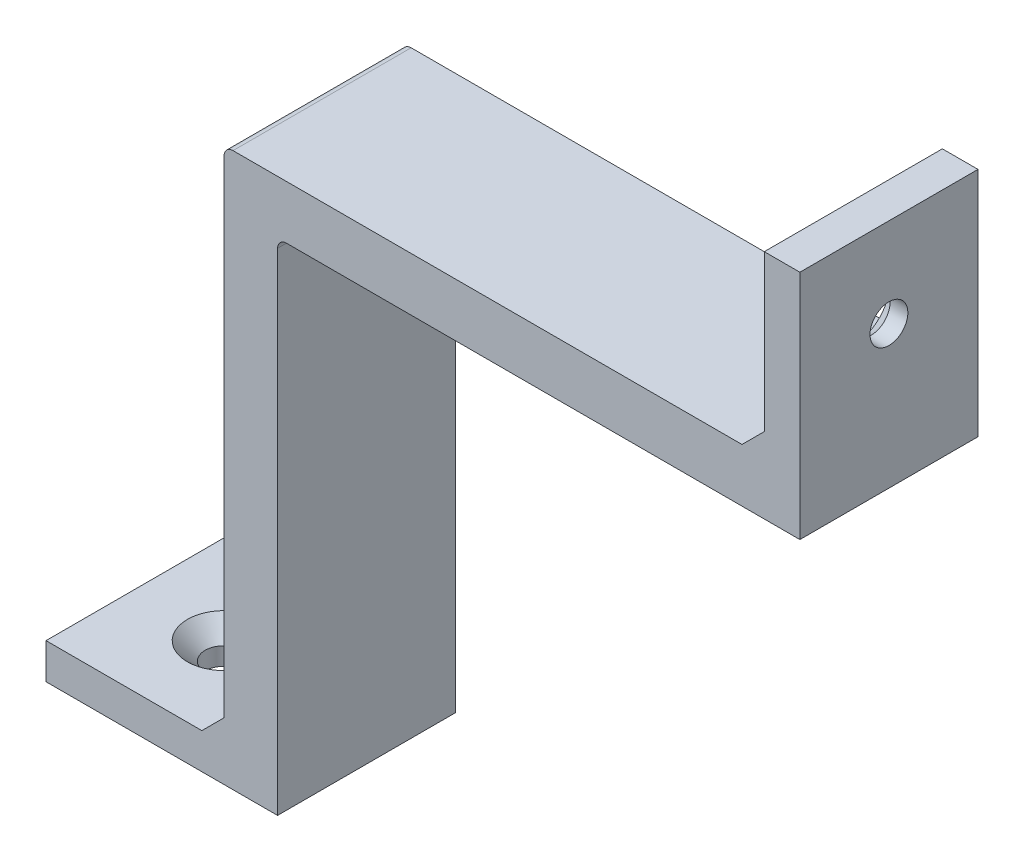
ISO-10303-21;
HEADER;
FILE_DESCRIPTION(('STEP AP214'),'2;1');
FILE_NAME('part.step','',(''),(''),'','','');
FILE_SCHEMA(('AUTOMOTIVE_DESIGN { 1 0 10303 214 1 1 1 1 }'));
ENDSEC;
DATA;
#1=APPLICATION_CONTEXT('core data for automotive mechanical design processes');
#2=APPLICATION_PROTOCOL_DEFINITION('international standard','automotive_design',2000,#1);
#3=PRODUCT_CONTEXT('',#1,'mechanical');
#4=PRODUCT('Part','Part','',(#3));
#5=PRODUCT_RELATED_PRODUCT_CATEGORY('part','',(#4));
#6=PRODUCT_DEFINITION_FORMATION('','',#4);
#7=PRODUCT_DEFINITION_CONTEXT('part definition',#1,'design');
#8=PRODUCT_DEFINITION('design','',#6,#7);
#9=PRODUCT_DEFINITION_SHAPE('','',#8);
#10=(LENGTH_UNIT() NAMED_UNIT(*) SI_UNIT(.MILLI.,.METRE.));
#11=(NAMED_UNIT(*) PLANE_ANGLE_UNIT() SI_UNIT($,.RADIAN.));
#12=(NAMED_UNIT(*) SI_UNIT($,.STERADIAN.) SOLID_ANGLE_UNIT());
#13=UNCERTAINTY_MEASURE_WITH_UNIT(LENGTH_MEASURE(1.E-05),#10,'distance_accuracy_value','');
#14=(GEOMETRIC_REPRESENTATION_CONTEXT(3) GLOBAL_UNCERTAINTY_ASSIGNED_CONTEXT((#13)) GLOBAL_UNIT_ASSIGNED_CONTEXT((#10,
#11,#12)) REPRESENTATION_CONTEXT('',''));
#15=CARTESIAN_POINT('',(0.,0.,0.));
#16=DIRECTION('',(0.,0.,1.));
#17=DIRECTION('',(1.,0.,0.));
#18=AXIS2_PLACEMENT_3D('',#15,#16,#17);
#19=CARTESIAN_POINT('',(0.,-9.85,20.));
#20=DIRECTION('',(0.,1.,0.));
#21=DIRECTION('',(-1.,0.,0.));
#22=AXIS2_PLACEMENT_3D('',#19,#20,#21);
#23=PLANE('',#22);
#24=CARTESIAN_POINT('',(-16.,-9.85,10.));
#25=DIRECTION('',(0.,1.,0.));
#26=DIRECTION('',(-1.,0.,0.));
#27=AXIS2_PLACEMENT_3D('',#24,#25,#26);
#28=CIRCLE('',#27,4.125);
#29=CARTESIAN_POINT('',(-20.125,-9.84999999999999,10.));
#30=VERTEX_POINT('',#29);
#31=EDGE_CURVE('E218',#30,#30,#28,.F.);
#32=ORIENTED_EDGE('',*,*,#31,.T.);
#33=EDGE_LOOP('',(#32));
#34=FACE_BOUND('',#33,.T.);
#35=DIRECTION('',(1.,0.,0.));
#36=VECTOR('',#35,1.);
#37=CARTESIAN_POINT('',(0.,-9.85,20.));
#38=LINE('',#37,#36);
#39=CARTESIAN_POINT('',(-26.,-9.84999999999999,20.));
#40=VERTEX_POINT('',#39);
#41=CARTESIAN_POINT('',(-8.5,-9.85,20.));
#42=VERTEX_POINT('',#41);
#43=EDGE_CURVE('E138',#40,#42,#38,.T.);
#44=ORIENTED_EDGE('',*,*,#43,.T.);
#45=DIRECTION('',(0.,0.,-1.));
#46=VECTOR('',#45,1.);
#47=CARTESIAN_POINT('',(-8.5,-9.85,20.));
#48=LINE('',#47,#46);
#49=CARTESIAN_POINT('',(-8.5,-9.85,0.));
#50=VERTEX_POINT('',#49);
#51=EDGE_CURVE('E232',#42,#50,#48,.T.);
#52=ORIENTED_EDGE('',*,*,#51,.T.);
#53=DIRECTION('',(1.,0.,0.));
#54=VECTOR('',#53,1.);
#55=CARTESIAN_POINT('',(0.,-9.85,0.));
#56=LINE('',#55,#54);
#57=CARTESIAN_POINT('',(-26.,-9.84999999999999,0.));
#58=VERTEX_POINT('',#57);
#59=EDGE_CURVE('E141',#58,#50,#56,.T.);
#60=ORIENTED_EDGE('',*,*,#59,.F.);
#61=DIRECTION('',(0.,0.,-1.));
#62=VECTOR('',#61,1.);
#63=CARTESIAN_POINT('',(-26.,-9.84999999999999,20.));
#64=LINE('',#63,#62);
#65=EDGE_CURVE('E135',#40,#58,#64,.T.);
#66=ORIENTED_EDGE('',*,*,#65,.F.);
#67=EDGE_LOOP('',(#44,#52,#60,#66));
#68=FACE_BOUND('',#67,.T.);
#69=ADVANCED_FACE('F33',(#34,#68),#23,.T.);
#70=CARTESIAN_POINT('',(-26.,0.,20.));
#71=DIRECTION('',(-1.,0.,0.));
#72=DIRECTION('',(0.,0.,1.));
#73=AXIS2_PLACEMENT_3D('',#70,#71,#72);
#74=PLANE('',#73);
#75=DIRECTION('',(0.,1.,0.));
#76=VECTOR('',#75,1.);
#77=CARTESIAN_POINT('',(-26.,0.,0.));
#78=LINE('',#77,#76);
#79=CARTESIAN_POINT('',(-26.,-13.85,0.));
#80=VERTEX_POINT('',#79);
#81=EDGE_CURVE('E184',#80,#58,#78,.T.);
#82=ORIENTED_EDGE('',*,*,#81,.F.);
#83=DIRECTION('',(0.,0.,-1.));
#84=VECTOR('',#83,1.);
#85=CARTESIAN_POINT('',(-26.,-13.85,20.));
#86=LINE('',#85,#84);
#87=CARTESIAN_POINT('',(-26.,-13.85,20.));
#88=VERTEX_POINT('',#87);
#89=EDGE_CURVE('E147',#88,#80,#86,.T.);
#90=ORIENTED_EDGE('',*,*,#89,.F.);
#91=DIRECTION('',(0.,1.,0.));
#92=VECTOR('',#91,1.);
#93=CARTESIAN_POINT('',(-26.,0.,20.));
#94=LINE('',#93,#92);
#95=EDGE_CURVE('E153',#88,#40,#94,.T.);
#96=ORIENTED_EDGE('',*,*,#95,.T.);
#97=ORIENTED_EDGE('',*,*,#65,.T.);
#98=EDGE_LOOP('',(#82,#90,#96,#97));
#99=FACE_BOUND('',#98,.T.);
#100=ADVANCED_FACE('F159',(#99),#74,.T.);
#101=CARTESIAN_POINT('',(0.,-13.85,20.));
#102=DIRECTION('',(0.,-1.,0.));
#103=DIRECTION('',(1.,0.,0.));
#104=AXIS2_PLACEMENT_3D('',#101,#102,#103);
#105=PLANE('',#104);
#106=CARTESIAN_POINT('',(-16.,-13.85,10.));
#107=DIRECTION('',(0.,1.,0.));
#108=DIRECTION('',(-1.,0.,0.));
#109=AXIS2_PLACEMENT_3D('',#106,#107,#108);
#110=CIRCLE('',#109,2.125);
#111=CARTESIAN_POINT('',(-18.125,-13.85,10.));
#112=VERTEX_POINT('',#111);
#113=EDGE_CURVE('E185',#112,#112,#110,.T.);
#114=ORIENTED_EDGE('',*,*,#113,.T.);
#115=EDGE_LOOP('',(#114));
#116=FACE_BOUND('',#115,.T.);
#117=DIRECTION('',(-1.,0.,0.));
#118=VECTOR('',#117,1.);
#119=CARTESIAN_POINT('',(0.,-13.85,0.));
#120=LINE('',#119,#118);
#121=CARTESIAN_POINT('',(0.,-13.85,0.));
#122=VERTEX_POINT('',#121);
#123=EDGE_CURVE('E187',#122,#80,#120,.T.);
#124=ORIENTED_EDGE('',*,*,#123,.F.);
#125=DIRECTION('',(0.,0.,-1.));
#126=VECTOR('',#125,1.);
#127=CARTESIAN_POINT('',(0.,-13.85,20.));
#128=LINE('',#127,#126);
#129=CARTESIAN_POINT('',(0.,-13.85,20.));
#130=VERTEX_POINT('',#129);
#131=EDGE_CURVE('E212',#130,#122,#128,.T.);
#132=ORIENTED_EDGE('',*,*,#131,.F.);
#133=DIRECTION('',(-1.,0.,0.));
#134=VECTOR('',#133,1.);
#135=CARTESIAN_POINT('',(0.,-13.85,20.));
#136=LINE('',#135,#134);
#137=EDGE_CURVE('E160',#130,#88,#136,.T.);
#138=ORIENTED_EDGE('',*,*,#137,.T.);
#139=ORIENTED_EDGE('',*,*,#89,.T.);
#140=EDGE_LOOP('',(#124,#132,#138,#139));
#141=FACE_BOUND('',#140,.T.);
#142=ADVANCED_FACE('F301',(#116,#141),#105,.T.);
#143=CARTESIAN_POINT('',(0.,0.,20.));
#144=DIRECTION('',(1.,0.,0.));
#145=DIRECTION('',(0.,0.,-1.));
#146=AXIS2_PLACEMENT_3D('',#143,#144,#145);
#147=PLANE('',#146);
#148=DIRECTION('',(0.,-1.,0.));
#149=VECTOR('',#148,1.);
#150=CARTESIAN_POINT('',(0.,0.,0.));
#151=LINE('',#150,#149);
#152=CARTESIAN_POINT('',(0.,41.3,0.));
#153=VERTEX_POINT('',#152);
#154=EDGE_CURVE('E190',#153,#122,#151,.T.);
#155=ORIENTED_EDGE('',*,*,#154,.F.);
#156=DIRECTION('',(0.,0.,-1.));
#157=VECTOR('',#156,1.);
#158=CARTESIAN_POINT('',(0.,41.3,20.));
#159=LINE('',#158,#157);
#160=CARTESIAN_POINT('',(0.,41.3,20.));
#161=VERTEX_POINT('',#160);
#162=EDGE_CURVE('E248',#153,#161,#159,.F.);
#163=ORIENTED_EDGE('',*,*,#162,.T.);
#164=DIRECTION('',(0.,-1.,0.));
#165=VECTOR('',#164,1.);
#166=CARTESIAN_POINT('',(0.,0.,20.));
#167=LINE('',#166,#165);
#168=EDGE_CURVE('E162',#161,#130,#167,.T.);
#169=ORIENTED_EDGE('',*,*,#168,.T.);
#170=ORIENTED_EDGE('',*,*,#131,.T.);
#171=EDGE_LOOP('',(#155,#163,#169,#170));
#172=FACE_BOUND('',#171,.T.);
#173=ADVANCED_FACE('F263',(#172),#147,.T.);
#174=CARTESIAN_POINT('',(0.,42.3,20.));
#175=DIRECTION('',(0.,-1.,0.));
#176=DIRECTION('',(0.,0.,-1.));
#177=AXIS2_PLACEMENT_3D('',#174,#175,#176);
#178=PLANE('',#177);
#179=DIRECTION('',(-1.,0.,0.));
#180=VECTOR('',#179,1.);
#181=CARTESIAN_POINT('',(0.,42.3,20.));
#182=LINE('',#181,#180);
#183=CARTESIAN_POINT('',(58.65,42.3,20.));
#184=VERTEX_POINT('',#183);
#185=CARTESIAN_POINT('',(1.,42.3,20.));
#186=VERTEX_POINT('',#185);
#187=EDGE_CURVE('E167',#184,#186,#182,.T.);
#188=ORIENTED_EDGE('',*,*,#187,.T.);
#189=DIRECTION('',(0.,0.,-1.));
#190=VECTOR('',#189,1.);
#191=CARTESIAN_POINT('',(1.,42.3,0.));
#192=LINE('',#191,#190);
#193=CARTESIAN_POINT('',(1.,42.3,0.));
#194=VERTEX_POINT('',#193);
#195=EDGE_CURVE('E245',#186,#194,#192,.T.);
#196=ORIENTED_EDGE('',*,*,#195,.T.);
#197=DIRECTION('',(-1.,0.,0.));
#198=VECTOR('',#197,1.);
#199=CARTESIAN_POINT('',(0.,42.3,0.));
#200=LINE('',#199,#198);
#201=CARTESIAN_POINT('',(58.65,42.3,0.));
#202=VERTEX_POINT('',#201);
#203=EDGE_CURVE('E192',#202,#194,#200,.T.);
#204=ORIENTED_EDGE('',*,*,#203,.F.);
#205=DIRECTION('',(0.,0.,-1.));
#206=VECTOR('',#205,1.);
#207=CARTESIAN_POINT('',(58.65,42.3,20.));
#208=LINE('',#207,#206);
#209=EDGE_CURVE('E210',#184,#202,#208,.T.);
#210=ORIENTED_EDGE('',*,*,#209,.F.);
#211=EDGE_LOOP('',(#188,#196,#204,#210));
#212=FACE_BOUND('',#211,.T.);
#213=ADVANCED_FACE('F272',(#212),#178,.T.);
#214=CARTESIAN_POINT('',(58.65,0.,20.));
#215=DIRECTION('',(1.,0.,0.));
#216=DIRECTION('',(0.,0.,-1.));
#217=AXIS2_PLACEMENT_3D('',#214,#215,#216);
#218=PLANE('',#217);
#219=CARTESIAN_POINT('',(58.65,58.3,10.));
#220=DIRECTION('',(-1.,0.,0.));
#221=DIRECTION('',(0.,-1.,0.));
#222=AXIS2_PLACEMENT_3D('',#219,#220,#221);
#223=CIRCLE('',#222,2.125);
#224=CARTESIAN_POINT('',(58.65,56.175,10.));
#225=VERTEX_POINT('',#224);
#226=EDGE_CURVE('E453',#225,#225,#223,.T.);
#227=ORIENTED_EDGE('',*,*,#226,.T.);
#228=EDGE_LOOP('',(#227));
#229=FACE_BOUND('',#228,.T.);
#230=DIRECTION('',(0.,-1.,0.));
#231=VECTOR('',#230,1.);
#232=CARTESIAN_POINT('',(58.65,0.,0.));
#233=LINE('',#232,#231);
#234=CARTESIAN_POINT('',(58.65,68.3,0.));
#235=VERTEX_POINT('',#234);
#236=EDGE_CURVE('E195',#235,#202,#233,.T.);
#237=ORIENTED_EDGE('',*,*,#236,.F.);
#238=DIRECTION('',(0.,0.,-1.));
#239=VECTOR('',#238,1.);
#240=CARTESIAN_POINT('',(58.65,68.3,20.));
#241=LINE('',#240,#239);
#242=CARTESIAN_POINT('',(58.65,68.3,20.));
#243=VERTEX_POINT('',#242);
#244=EDGE_CURVE('E208',#243,#235,#241,.T.);
#245=ORIENTED_EDGE('',*,*,#244,.F.);
#246=DIRECTION('',(0.,-1.,0.));
#247=VECTOR('',#246,1.);
#248=CARTESIAN_POINT('',(58.65,0.,20.));
#249=LINE('',#248,#247);
#250=EDGE_CURVE('E170',#243,#184,#249,.T.);
#251=ORIENTED_EDGE('',*,*,#250,.T.);
#252=ORIENTED_EDGE('',*,*,#209,.T.);
#253=EDGE_LOOP('',(#237,#245,#251,#252));
#254=FACE_BOUND('',#253,.T.);
#255=ADVANCED_FACE('F275',(#229,#254),#218,.T.);
#256=CARTESIAN_POINT('',(-2.36963226818431E-13,68.2999999999998,20.));
#257=DIRECTION('',(0.,-1.,0.));
#258=DIRECTION('',(1.,0.,0.));
#259=AXIS2_PLACEMENT_3D('',#256,#257,#258);
#260=PLANE('',#259);
#261=DIRECTION('',(-1.,0.,0.));
#262=VECTOR('',#261,1.);
#263=CARTESIAN_POINT('',(-2.36963226818431E-13,68.2999999999998,0.));
#264=LINE('',#263,#262);
#265=CARTESIAN_POINT('',(54.65,68.3,0.));
#266=VERTEX_POINT('',#265);
#267=EDGE_CURVE('E198',#235,#266,#264,.T.);
#268=ORIENTED_EDGE('',*,*,#267,.T.);
#269=DIRECTION('',(0.,0.,-1.));
#270=VECTOR('',#269,1.);
#271=CARTESIAN_POINT('',(54.65,68.3,20.));
#272=LINE('',#271,#270);
#273=CARTESIAN_POINT('',(54.65,68.3,20.));
#274=VERTEX_POINT('',#273);
#275=EDGE_CURVE('E182',#274,#266,#272,.T.);
#276=ORIENTED_EDGE('',*,*,#275,.F.);
#277=DIRECTION('',(-1.,0.,0.));
#278=VECTOR('',#277,1.);
#279=CARTESIAN_POINT('',(-2.36963226818431E-13,68.2999999999998,20.));
#280=LINE('',#279,#278);
#281=EDGE_CURVE('E173',#243,#274,#280,.T.);
#282=ORIENTED_EDGE('',*,*,#281,.F.);
#283=ORIENTED_EDGE('',*,*,#244,.T.);
#284=EDGE_LOOP('',(#268,#276,#282,#283));
#285=FACE_BOUND('',#284,.T.);
#286=ADVANCED_FACE('F281',(#285),#260,.F.);
#287=CARTESIAN_POINT('',(54.65,0.,20.));
#288=DIRECTION('',(1.,0.,0.));
#289=DIRECTION('',(0.,1.,0.));
#290=AXIS2_PLACEMENT_3D('',#287,#288,#289);
#291=PLANE('',#290);
#292=CARTESIAN_POINT('',(54.65,58.3,10.));
#293=DIRECTION('',(1.,0.,0.));
#294=DIRECTION('',(0.,1.,0.));
#295=AXIS2_PLACEMENT_3D('',#292,#293,#294);
#296=CIRCLE('',#295,4.12500000000002);
#297=CARTESIAN_POINT('',(54.65,62.425,10.));
#298=VERTEX_POINT('',#297);
#299=EDGE_CURVE('E224',#298,#298,#296,.T.);
#300=ORIENTED_EDGE('',*,*,#299,.T.);
#301=EDGE_LOOP('',(#300));
#302=FACE_BOUND('',#301,.T.);
#303=DIRECTION('',(0.,-1.,0.));
#304=VECTOR('',#303,1.);
#305=CARTESIAN_POINT('',(54.65,0.,0.));
#306=LINE('',#305,#304);
#307=CARTESIAN_POINT('',(54.65,50.8,0.));
#308=VERTEX_POINT('',#307);
#309=EDGE_CURVE('E200',#266,#308,#306,.T.);
#310=ORIENTED_EDGE('',*,*,#309,.T.);
#311=DIRECTION('',(0.,0.,1.));
#312=VECTOR('',#311,1.);
#313=CARTESIAN_POINT('',(54.65,50.8,20.));
#314=LINE('',#313,#312);
#315=CARTESIAN_POINT('',(54.65,50.8,20.));
#316=VERTEX_POINT('',#315);
#317=EDGE_CURVE('E230',#308,#316,#314,.T.);
#318=ORIENTED_EDGE('',*,*,#317,.T.);
#319=DIRECTION('',(0.,-1.,0.));
#320=VECTOR('',#319,1.);
#321=CARTESIAN_POINT('',(54.65,0.,20.));
#322=LINE('',#321,#320);
#323=EDGE_CURVE('E175',#274,#316,#322,.T.);
#324=ORIENTED_EDGE('',*,*,#323,.F.);
#325=ORIENTED_EDGE('',*,*,#275,.T.);
#326=EDGE_LOOP('',(#310,#318,#324,#325));
#327=FACE_BOUND('',#326,.T.);
#328=ADVANCED_FACE('F285',(#302,#327),#291,.F.);
#329=CARTESIAN_POINT('',(0.,48.3,20.));
#330=DIRECTION('',(0.,-1.,0.));
#331=DIRECTION('',(1.,0.,0.));
#332=AXIS2_PLACEMENT_3D('',#329,#330,#331);
#333=PLANE('',#332);
#334=DIRECTION('',(-1.,0.,0.));
#335=VECTOR('',#334,1.);
#336=CARTESIAN_POINT('',(0.,48.3,0.));
#337=LINE('',#336,#335);
#338=CARTESIAN_POINT('',(52.15,48.3,0.));
#339=VERTEX_POINT('',#338);
#340=CARTESIAN_POINT('',(-5.,48.3,0.));
#341=VERTEX_POINT('',#340);
#342=EDGE_CURVE('E203',#339,#341,#337,.T.);
#343=ORIENTED_EDGE('',*,*,#342,.T.);
#344=DIRECTION('',(0.,0.,-1.));
#345=VECTOR('',#344,1.);
#346=CARTESIAN_POINT('',(-5.,48.3,20.));
#347=LINE('',#346,#345);
#348=CARTESIAN_POINT('',(-5.,48.3,20.));
#349=VERTEX_POINT('',#348);
#350=EDGE_CURVE('E48',#341,#349,#347,.F.);
#351=ORIENTED_EDGE('',*,*,#350,.T.);
#352=DIRECTION('',(-1.,0.,0.));
#353=VECTOR('',#352,1.);
#354=CARTESIAN_POINT('',(0.,48.3,20.));
#355=LINE('',#354,#353);
#356=CARTESIAN_POINT('',(52.15,48.3,20.));
#357=VERTEX_POINT('',#356);
#358=EDGE_CURVE('E178',#357,#349,#355,.T.);
#359=ORIENTED_EDGE('',*,*,#358,.F.);
#360=DIRECTION('',(0.,0.,-1.));
#361=VECTOR('',#360,1.);
#362=CARTESIAN_POINT('',(52.15,48.3,0.));
#363=LINE('',#362,#361);
#364=EDGE_CURVE('E227',#357,#339,#363,.T.);
#365=ORIENTED_EDGE('',*,*,#364,.T.);
#366=EDGE_LOOP('',(#343,#351,#359,#365));
#367=FACE_BOUND('',#366,.T.);
#368=ADVANCED_FACE('F291',(#367),#333,.F.);
#369=CARTESIAN_POINT('',(-5.99999999999999,0.,20.));
#370=DIRECTION('',(1.,0.,0.));
#371=DIRECTION('',(0.,1.,0.));
#372=AXIS2_PLACEMENT_3D('',#369,#370,#371);
#373=PLANE('',#372);
#374=DIRECTION('',(0.,-1.,0.));
#375=VECTOR('',#374,1.);
#376=CARTESIAN_POINT('',(-5.99999999999999,0.,20.));
#377=LINE('',#376,#375);
#378=CARTESIAN_POINT('',(-6.,47.3,20.));
#379=VERTEX_POINT('',#378);
#380=CARTESIAN_POINT('',(-5.99999999999999,-7.35000000000002,20.));
#381=VERTEX_POINT('',#380);
#382=EDGE_CURVE('E180',#379,#381,#377,.T.);
#383=ORIENTED_EDGE('',*,*,#382,.F.);
#384=DIRECTION('',(0.,0.,-1.));
#385=VECTOR('',#384,1.);
#386=CARTESIAN_POINT('',(-6.,47.3,20.));
#387=LINE('',#386,#385);
#388=CARTESIAN_POINT('',(-6.,47.3,0.));
#389=VERTEX_POINT('',#388);
#390=EDGE_CURVE('E250',#379,#389,#387,.T.);
#391=ORIENTED_EDGE('',*,*,#390,.T.);
#392=DIRECTION('',(0.,-1.,0.));
#393=VECTOR('',#392,1.);
#394=CARTESIAN_POINT('',(-5.99999999999999,0.,0.));
#395=LINE('',#394,#393);
#396=CARTESIAN_POINT('',(-5.99999999999999,-7.35000000000002,0.));
#397=VERTEX_POINT('',#396);
#398=EDGE_CURVE('E157',#389,#397,#395,.T.);
#399=ORIENTED_EDGE('',*,*,#398,.T.);
#400=DIRECTION('',(0.,0.,1.));
#401=VECTOR('',#400,1.);
#402=CARTESIAN_POINT('',(-5.99999999999999,-7.35000000000002,20.));
#403=LINE('',#402,#401);
#404=EDGE_CURVE('E234',#397,#381,#403,.T.);
#405=ORIENTED_EDGE('',*,*,#404,.T.);
#406=EDGE_LOOP('',(#383,#391,#399,#405));
#407=FACE_BOUND('',#406,.T.);
#408=ADVANCED_FACE('F296',(#407),#373,.F.);
#409=CARTESIAN_POINT('',(0.,0.,20.));
#410=DIRECTION('',(0.,0.,1.));
#411=DIRECTION('',(1.,0.,0.));
#412=AXIS2_PLACEMENT_3D('',#409,#410,#411);
#413=PLANE('',#412);
#414=ORIENTED_EDGE('',*,*,#358,.T.);
#415=CARTESIAN_POINT('',(-5.,47.3,20.));
#416=DIRECTION('',(0.,0.,1.));
#417=DIRECTION('',(1.,0.,0.));
#418=AXIS2_PLACEMENT_3D('',#415,#416,#417);
#419=CIRCLE('',#418,1.);
#420=EDGE_CURVE('E255',#349,#379,#419,.T.);
#421=ORIENTED_EDGE('',*,*,#420,.T.);
#422=ORIENTED_EDGE('',*,*,#382,.T.);
#423=DIRECTION('',(-0.707106781186551,-0.707106781186544,0.));
#424=VECTOR('',#423,1.);
#425=CARTESIAN_POINT('',(-8.5,-9.85,20.));
#426=LINE('',#425,#424);
#427=EDGE_CURVE('E156',#381,#42,#426,.T.);
#428=ORIENTED_EDGE('',*,*,#427,.T.);
#429=ORIENTED_EDGE('',*,*,#43,.F.);
#430=ORIENTED_EDGE('',*,*,#95,.F.);
#431=ORIENTED_EDGE('',*,*,#137,.F.);
#432=ORIENTED_EDGE('',*,*,#168,.F.);
#433=CARTESIAN_POINT('',(1.,41.3,20.));
#434=DIRECTION('',(0.,0.,1.));
#435=DIRECTION('',(1.,0.,0.));
#436=AXIS2_PLACEMENT_3D('',#433,#434,#435);
#437=CIRCLE('',#436,1.);
#438=EDGE_CURVE('E11',#161,#186,#437,.F.);
#439=ORIENTED_EDGE('',*,*,#438,.T.);
#440=ORIENTED_EDGE('',*,*,#187,.F.);
#441=ORIENTED_EDGE('',*,*,#250,.F.);
#442=ORIENTED_EDGE('',*,*,#281,.T.);
#443=ORIENTED_EDGE('',*,*,#323,.T.);
#444=DIRECTION('',(0.707106781186549,0.707106781186546,0.));
#445=VECTOR('',#444,1.);
#446=CARTESIAN_POINT('',(52.15,48.3,20.));
#447=LINE('',#446,#445);
#448=EDGE_CURVE('E239',#316,#357,#447,.F.);
#449=ORIENTED_EDGE('',*,*,#448,.T.);
#450=EDGE_LOOP('',(#414,#421,#422,#428,#429,#430,#431,#432,#439,#440,#441,#442,#443,#449));
#451=FACE_BOUND('',#450,.T.);
#452=ADVANCED_FACE('F151',(#451),#413,.T.);
#453=CARTESIAN_POINT('',(0.,0.,0.));
#454=DIRECTION('',(0.,0.,1.));
#455=DIRECTION('',(1.,0.,0.));
#456=AXIS2_PLACEMENT_3D('',#453,#454,#455);
#457=PLANE('',#456);
#458=ORIENTED_EDGE('',*,*,#398,.F.);
#459=CARTESIAN_POINT('',(-5.,47.3,0.));
#460=DIRECTION('',(0.,0.,1.));
#461=DIRECTION('',(1.,0.,0.));
#462=AXIS2_PLACEMENT_3D('',#459,#460,#461);
#463=CIRCLE('',#462,1.);
#464=EDGE_CURVE('E56',#389,#341,#463,.F.);
#465=ORIENTED_EDGE('',*,*,#464,.T.);
#466=ORIENTED_EDGE('',*,*,#342,.F.);
#467=DIRECTION('',(-0.707106781186549,-0.707106781186546,0.));
#468=VECTOR('',#467,1.);
#469=CARTESIAN_POINT('',(1.92499999999986,-1.92499999999987,0.));
#470=LINE('',#469,#468);
#471=EDGE_CURVE('E237',#339,#308,#470,.F.);
#472=ORIENTED_EDGE('',*,*,#471,.T.);
#473=ORIENTED_EDGE('',*,*,#309,.F.);
#474=ORIENTED_EDGE('',*,*,#267,.F.);
#475=ORIENTED_EDGE('',*,*,#236,.T.);
#476=ORIENTED_EDGE('',*,*,#203,.T.);
#477=CARTESIAN_POINT('',(1.,41.3,0.));
#478=DIRECTION('',(0.,0.,1.));
#479=DIRECTION('',(1.,0.,0.));
#480=AXIS2_PLACEMENT_3D('',#477,#478,#479);
#481=CIRCLE('',#480,1.);
#482=EDGE_CURVE('E41',#194,#153,#481,.T.);
#483=ORIENTED_EDGE('',*,*,#482,.T.);
#484=ORIENTED_EDGE('',*,*,#154,.T.);
#485=ORIENTED_EDGE('',*,*,#123,.T.);
#486=ORIENTED_EDGE('',*,*,#81,.T.);
#487=ORIENTED_EDGE('',*,*,#59,.T.);
#488=DIRECTION('',(0.707106781186551,0.707106781186544,0.));
#489=VECTOR('',#488,1.);
#490=CARTESIAN_POINT('',(0.675000000000047,-0.675000000000055,0.));
#491=LINE('',#490,#489);
#492=EDGE_CURVE('E241',#50,#397,#491,.T.);
#493=ORIENTED_EDGE('',*,*,#492,.T.);
#494=EDGE_LOOP('',(#458,#465,#466,#472,#473,#474,#475,#476,#483,#484,#485,#486,#487,#493));
#495=FACE_BOUND('',#494,.T.);
#496=ADVANCED_FACE('F257',(#495),#457,.F.);
#497=CARTESIAN_POINT('',(-16.,-13.85,10.));
#498=DIRECTION('',(0.,1.,0.));
#499=DIRECTION('',(-1.,0.,0.));
#500=AXIS2_PLACEMENT_3D('',#497,#498,#499);
#501=CYLINDRICAL_SURFACE('',#500,2.125);
#502=CARTESIAN_POINT('',(-16.,-11.85,10.));
#503=DIRECTION('',(0.,1.,0.));
#504=DIRECTION('',(0.,0.,1.));
#505=AXIS2_PLACEMENT_3D('',#502,#503,#504);
#506=CIRCLE('',#505,2.125);
#507=CARTESIAN_POINT('',(-16.,-11.85,12.125));
#508=VERTEX_POINT('',#507);
#509=EDGE_CURVE('E146',#508,#508,#506,.T.);
#510=ORIENTED_EDGE('',*,*,#509,.T.);
#511=EDGE_LOOP('',(#510));
#512=FACE_BOUND('',#511,.T.);
#513=ORIENTED_EDGE('',*,*,#113,.F.);
#514=EDGE_LOOP('',(#513));
#515=FACE_BOUND('',#514,.T.);
#516=ADVANCED_FACE('F352',(#512,#515),#501,.F.);
#517=CARTESIAN_POINT('',(58.65,58.3,10.));
#518=DIRECTION('',(-1.,0.,0.));
#519=DIRECTION('',(0.,-1.,0.));
#520=AXIS2_PLACEMENT_3D('',#517,#518,#519);
#521=CYLINDRICAL_SURFACE('',#520,2.125);
#522=CARTESIAN_POINT('',(56.65,58.3,10.));
#523=DIRECTION('',(1.,0.,0.));
#524=DIRECTION('',(0.,0.,-1.));
#525=AXIS2_PLACEMENT_3D('',#522,#523,#524);
#526=CIRCLE('',#525,2.125);
#527=CARTESIAN_POINT('',(56.65,58.3,7.875));
#528=VERTEX_POINT('',#527);
#529=EDGE_CURVE('E221',#528,#528,#526,.F.);
#530=ORIENTED_EDGE('',*,*,#529,.T.);
#531=EDGE_LOOP('',(#530));
#532=FACE_BOUND('',#531,.T.);
#533=ORIENTED_EDGE('',*,*,#226,.F.);
#534=EDGE_LOOP('',(#533));
#535=FACE_BOUND('',#534,.T.);
#536=ADVANCED_FACE('F325',(#532,#535),#521,.F.);
#537=CARTESIAN_POINT('',(-16.,-11.85,10.));
#538=DIRECTION('',(0.,1.,0.));
#539=DIRECTION('',(0.,0.,1.));
#540=AXIS2_PLACEMENT_3D('',#537,#538,#539);
#541=CONICAL_SURFACE('',#540,2.125,0.785398163397449);
#542=ORIENTED_EDGE('',*,*,#31,.F.);
#543=EDGE_LOOP('',(#542));
#544=FACE_BOUND('',#543,.T.);
#545=ORIENTED_EDGE('',*,*,#509,.F.);
#546=EDGE_LOOP('',(#545));
#547=FACE_BOUND('',#546,.T.);
#548=ADVANCED_FACE('F321',(#544,#547),#541,.F.);
#549=CARTESIAN_POINT('',(56.65,58.3,10.));
#550=DIRECTION('',(-1.,0.,0.));
#551=DIRECTION('',(0.,0.,1.));
#552=AXIS2_PLACEMENT_3D('',#549,#550,#551);
#553=CONICAL_SURFACE('',#552,2.125,0.78539816339745);
#554=ORIENTED_EDGE('',*,*,#299,.F.);
#555=EDGE_LOOP('',(#554));
#556=FACE_BOUND('',#555,.T.);
#557=ORIENTED_EDGE('',*,*,#529,.F.);
#558=EDGE_LOOP('',(#557));
#559=FACE_BOUND('',#558,.T.);
#560=ADVANCED_FACE('F324',(#556,#559),#553,.F.);
#561=CARTESIAN_POINT('',(52.15,48.3,20.));
#562=DIRECTION('',(-0.707106781186546,0.707106781186549,0.));
#563=DIRECTION('',(0.,0.,1.));
#564=AXIS2_PLACEMENT_3D('',#561,#562,#563);
#565=PLANE('',#564);
#566=ORIENTED_EDGE('',*,*,#448,.F.);
#567=ORIENTED_EDGE('',*,*,#317,.F.);
#568=ORIENTED_EDGE('',*,*,#471,.F.);
#569=ORIENTED_EDGE('',*,*,#364,.F.);
#570=EDGE_LOOP('',(#566,#567,#568,#569));
#571=FACE_BOUND('',#570,.T.);
#572=ADVANCED_FACE('F288',(#571),#565,.T.);
#573=CARTESIAN_POINT('',(-8.5,-9.85,20.));
#574=DIRECTION('',(0.707106781186544,-0.707106781186551,0.));
#575=DIRECTION('',(0.,0.,-1.));
#576=AXIS2_PLACEMENT_3D('',#573,#574,#575);
#577=PLANE('',#576);
#578=ORIENTED_EDGE('',*,*,#427,.F.);
#579=ORIENTED_EDGE('',*,*,#404,.F.);
#580=ORIENTED_EDGE('',*,*,#492,.F.);
#581=ORIENTED_EDGE('',*,*,#51,.F.);
#582=EDGE_LOOP('',(#578,#579,#580,#581));
#583=FACE_BOUND('',#582,.T.);
#584=ADVANCED_FACE('F299',(#583),#577,.F.);
#585=CARTESIAN_POINT('',(1.,41.3,20.));
#586=DIRECTION('',(0.,0.,1.));
#587=DIRECTION('',(1.,0.,0.));
#588=AXIS2_PLACEMENT_3D('',#585,#586,#587);
#589=CYLINDRICAL_SURFACE('',#588,1.);
#590=ORIENTED_EDGE('',*,*,#438,.F.);
#591=ORIENTED_EDGE('',*,*,#162,.F.);
#592=ORIENTED_EDGE('',*,*,#482,.F.);
#593=ORIENTED_EDGE('',*,*,#195,.F.);
#594=EDGE_LOOP('',(#590,#591,#592,#593));
#595=FACE_BOUND('',#594,.T.);
#596=ADVANCED_FACE('F268',(#595),#589,.F.);
#597=CARTESIAN_POINT('',(-5.,47.3,20.));
#598=DIRECTION('',(0.,0.,-1.));
#599=DIRECTION('',(-1.,0.,0.));
#600=AXIS2_PLACEMENT_3D('',#597,#598,#599);
#601=CYLINDRICAL_SURFACE('',#600,1.);
#602=ORIENTED_EDGE('',*,*,#420,.F.);
#603=ORIENTED_EDGE('',*,*,#350,.F.);
#604=ORIENTED_EDGE('',*,*,#464,.F.);
#605=ORIENTED_EDGE('',*,*,#390,.F.);
#606=EDGE_LOOP('',(#602,#603,#604,#605));
#607=FACE_BOUND('',#606,.T.);
#608=ADVANCED_FACE('F35',(#607),#601,.T.);
#609=CLOSED_SHELL('',(#69,#100,#142,#173,#213,#255,#286,#328,#368,#408,#452,#496,#516,#536,#548,
#560,#572,#584,#596,#608));
#610=MANIFOLD_SOLID_BREP('B2',#609);
#611=ADVANCED_BREP_SHAPE_REPRESENTATION('',(#18,#610),#14);
#612=SHAPE_DEFINITION_REPRESENTATION(#9,#611);
ENDSEC;
END-ISO-10303-21;
